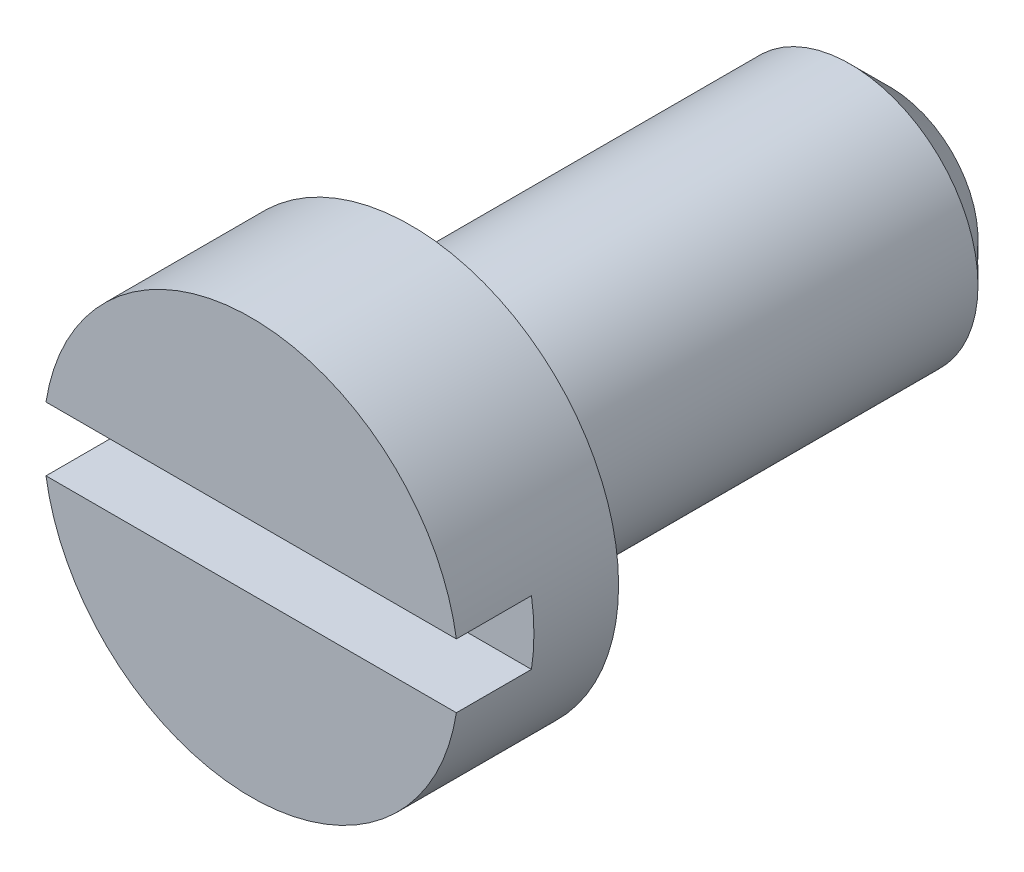
ISO-10303-21;
HEADER;
FILE_DESCRIPTION(('STEP AP214'),'2;1');
FILE_NAME('part.step','',(''),(''),'','','');
FILE_SCHEMA(('AUTOMOTIVE_DESIGN { 1 0 10303 214 1 1 1 1 }'));
ENDSEC;
DATA;
#1=APPLICATION_CONTEXT('core data for automotive mechanical design processes');
#2=APPLICATION_PROTOCOL_DEFINITION('international standard','automotive_design',2000,#1);
#3=PRODUCT_CONTEXT('',#1,'mechanical');
#4=PRODUCT('Part','Part','',(#3));
#5=PRODUCT_RELATED_PRODUCT_CATEGORY('part','',(#4));
#6=PRODUCT_DEFINITION_FORMATION('','',#4);
#7=PRODUCT_DEFINITION_CONTEXT('part definition',#1,'design');
#8=PRODUCT_DEFINITION('design','',#6,#7);
#9=PRODUCT_DEFINITION_SHAPE('','',#8);
#10=(LENGTH_UNIT() NAMED_UNIT(*) SI_UNIT(.MILLI.,.METRE.));
#11=(NAMED_UNIT(*) PLANE_ANGLE_UNIT() SI_UNIT($,.RADIAN.));
#12=(NAMED_UNIT(*) SI_UNIT($,.STERADIAN.) SOLID_ANGLE_UNIT());
#13=UNCERTAINTY_MEASURE_WITH_UNIT(LENGTH_MEASURE(1.E-05),#10,'distance_accuracy_value','');
#14=(GEOMETRIC_REPRESENTATION_CONTEXT(3) GLOBAL_UNCERTAINTY_ASSIGNED_CONTEXT((#13)) GLOBAL_UNIT_ASSIGNED_CONTEXT((#10,
#11,#12)) REPRESENTATION_CONTEXT('',''));
#15=CARTESIAN_POINT('',(0.,0.,0.));
#16=DIRECTION('',(0.,0.,1.));
#17=DIRECTION('',(1.,0.,0.));
#18=AXIS2_PLACEMENT_3D('',#15,#16,#17);
#19=CARTESIAN_POINT('',(0.,0.,5.));
#20=DIRECTION('',(0.,0.,1.));
#21=DIRECTION('',(1.,0.,0.));
#22=AXIS2_PLACEMENT_3D('',#19,#20,#21);
#23=PLANE('',#22);
#24=DIRECTION('',(-1.,0.,0.));
#25=VECTOR('',#24,1.);
#26=CARTESIAN_POINT('',(0.,1.,5.));
#27=LINE('',#26,#25);
#28=CARTESIAN_POINT('',(6.42261628933257,1.,5.));
#29=VERTEX_POINT('',#28);
#30=CARTESIAN_POINT('',(-6.42261628933257,1.,5.));
#31=VERTEX_POINT('',#30);
#32=EDGE_CURVE('E77',#29,#31,#27,.T.);
#33=ORIENTED_EDGE('',*,*,#32,.F.);
#34=CARTESIAN_POINT('',(0.,0.,5.));
#35=DIRECTION('',(0.,0.,1.));
#36=DIRECTION('',(1.,0.,0.));
#37=AXIS2_PLACEMENT_3D('',#34,#35,#36);
#38=CIRCLE('',#37,6.5);
#39=EDGE_CURVE('E90',#29,#31,#38,.T.);
#40=ORIENTED_EDGE('',*,*,#39,.T.);
#41=EDGE_LOOP('',(#33,#40));
#42=FACE_BOUND('',#41,.T.);
#43=ADVANCED_FACE('F29',(#42),#23,.T.);
#44=CARTESIAN_POINT('',(0.,0.,0.));
#45=DIRECTION('',(0.,0.,1.));
#46=DIRECTION('',(1.,0.,0.));
#47=AXIS2_PLACEMENT_3D('',#44,#45,#46);
#48=PLANE('',#47);
#49=CARTESIAN_POINT('',(0.,0.,0.));
#50=DIRECTION('',(0.,0.,1.));
#51=DIRECTION('',(1.,0.,0.));
#52=AXIS2_PLACEMENT_3D('',#49,#50,#51);
#53=CIRCLE('',#52,6.5);
#54=CARTESIAN_POINT('',(6.5,0.,0.));
#55=VERTEX_POINT('',#54);
#56=EDGE_CURVE('E91',#55,#55,#53,.T.);
#57=ORIENTED_EDGE('',*,*,#56,.F.);
#58=EDGE_LOOP('',(#57));
#59=FACE_BOUND('',#58,.T.);
#60=CARTESIAN_POINT('',(0.,0.,0.));
#61=DIRECTION('',(0.,0.,1.));
#62=DIRECTION('',(1.,0.,0.));
#63=AXIS2_PLACEMENT_3D('',#60,#61,#62);
#64=CIRCLE('',#63,4.);
#65=CARTESIAN_POINT('',(4.,0.,0.));
#66=VERTEX_POINT('',#65);
#67=EDGE_CURVE('E78',#66,#66,#64,.F.);
#68=ORIENTED_EDGE('',*,*,#67,.F.);
#69=EDGE_LOOP('',(#68));
#70=FACE_BOUND('',#69,.T.);
#71=ADVANCED_FACE('F118',(#59,#70),#48,.F.);
#72=CARTESIAN_POINT('',(0.,0.,5.));
#73=DIRECTION('',(0.,0.,-1.));
#74=DIRECTION('',(-1.,0.,0.));
#75=AXIS2_PLACEMENT_3D('',#72,#73,#74);
#76=CYLINDRICAL_SURFACE('',#75,6.5);
#77=CARTESIAN_POINT('',(0.,0.,2.65));
#78=DIRECTION('',(0.,0.,1.));
#79=DIRECTION('',(1.,0.,0.));
#80=AXIS2_PLACEMENT_3D('',#77,#78,#79);
#81=CIRCLE('',#80,6.5);
#82=CARTESIAN_POINT('',(-6.42261628933257,1.,2.65));
#83=VERTEX_POINT('',#82);
#84=CARTESIAN_POINT('',(-6.42261628933257,-1.,2.65));
#85=VERTEX_POINT('',#84);
#86=EDGE_CURVE('E102',#83,#85,#81,.T.);
#87=ORIENTED_EDGE('',*,*,#86,.F.);
#88=DIRECTION('',(0.,0.,-1.));
#89=VECTOR('',#88,1.);
#90=CARTESIAN_POINT('',(-6.42261628933257,1.,5.));
#91=LINE('',#90,#89);
#92=EDGE_CURVE('E52',#83,#31,#91,.F.);
#93=ORIENTED_EDGE('',*,*,#92,.T.);
#94=ORIENTED_EDGE('',*,*,#39,.F.);
#95=DIRECTION('',(0.,0.,-1.));
#96=VECTOR('',#95,1.);
#97=CARTESIAN_POINT('',(6.42261628933257,1.,5.));
#98=LINE('',#97,#96);
#99=CARTESIAN_POINT('',(6.42261628933257,1.,2.65));
#100=VERTEX_POINT('',#99);
#101=EDGE_CURVE('E95',#29,#100,#98,.T.);
#102=ORIENTED_EDGE('',*,*,#101,.T.);
#103=CARTESIAN_POINT('',(6.42261628933257,-1.,2.65));
#104=VERTEX_POINT('',#103);
#105=EDGE_CURVE('E86',#104,#100,#81,.T.);
#106=ORIENTED_EDGE('',*,*,#105,.F.);
#107=DIRECTION('',(0.,0.,-1.));
#108=VECTOR('',#107,1.);
#109=CARTESIAN_POINT('',(6.42261628933257,-1.,5.));
#110=LINE('',#109,#108);
#111=CARTESIAN_POINT('',(6.42261628933257,-1.,5.));
#112=VERTEX_POINT('',#111);
#113=EDGE_CURVE('E72',#104,#112,#110,.F.);
#114=ORIENTED_EDGE('',*,*,#113,.T.);
#115=CARTESIAN_POINT('',(-6.42261628933257,-1.,5.));
#116=VERTEX_POINT('',#115);
#117=EDGE_CURVE('E84',#116,#112,#38,.T.);
#118=ORIENTED_EDGE('',*,*,#117,.F.);
#119=DIRECTION('',(0.,0.,-1.));
#120=VECTOR('',#119,1.);
#121=CARTESIAN_POINT('',(-6.42261628933257,-1.,5.));
#122=LINE('',#121,#120);
#123=EDGE_CURVE('E44',#116,#85,#122,.T.);
#124=ORIENTED_EDGE('',*,*,#123,.T.);
#125=EDGE_LOOP('',(#87,#93,#94,#102,#106,#114,#118,#124));
#126=FACE_BOUND('',#125,.T.);
#127=ORIENTED_EDGE('',*,*,#56,.T.);
#128=EDGE_LOOP('',(#127));
#129=FACE_BOUND('',#128,.T.);
#130=ADVANCED_FACE('F31',(#126,#129),#76,.T.);
#131=DIRECTION('',(1.,0.,0.));
#132=VECTOR('',#131,1.);
#133=CARTESIAN_POINT('',(0.,-1.,5.));
#134=LINE('',#133,#132);
#135=EDGE_CURVE('E69',#116,#112,#134,.T.);
#136=ORIENTED_EDGE('',*,*,#135,.F.);
#137=ORIENTED_EDGE('',*,*,#117,.T.);
#138=EDGE_LOOP('',(#136,#137));
#139=FACE_BOUND('',#138,.T.);
#140=ADVANCED_FACE('F89',(#139),#23,.T.);
#141=CARTESIAN_POINT('',(0.,0.,-15.));
#142=DIRECTION('',(0.,0.,1.));
#143=DIRECTION('',(1.,0.,0.));
#144=AXIS2_PLACEMENT_3D('',#141,#142,#143);
#145=CYLINDRICAL_SURFACE('',#144,4.);
#146=CARTESIAN_POINT('',(0.,0.,-13.75));
#147=DIRECTION('',(0.,0.,-1.));
#148=DIRECTION('',(-1.,0.,0.));
#149=AXIS2_PLACEMENT_3D('',#146,#147,#148);
#150=CIRCLE('',#149,4.);
#151=CARTESIAN_POINT('',(-4.,0.,-13.75));
#152=VERTEX_POINT('',#151);
#153=EDGE_CURVE('E11',#152,#152,#150,.F.);
#154=ORIENTED_EDGE('',*,*,#153,.T.);
#155=EDGE_LOOP('',(#154));
#156=FACE_BOUND('',#155,.T.);
#157=ORIENTED_EDGE('',*,*,#67,.T.);
#158=EDGE_LOOP('',(#157));
#159=FACE_BOUND('',#158,.T.);
#160=ADVANCED_FACE('F126',(#156,#159),#145,.T.);
#161=CARTESIAN_POINT('',(0.,0.,-15.));
#162=DIRECTION('',(0.,0.,-1.));
#163=DIRECTION('',(-1.,0.,0.));
#164=AXIS2_PLACEMENT_3D('',#161,#162,#163);
#165=PLANE('',#164);
#166=CARTESIAN_POINT('',(0.,0.,-15.));
#167=DIRECTION('',(0.,0.,-1.));
#168=DIRECTION('',(-1.,0.,0.));
#169=AXIS2_PLACEMENT_3D('',#166,#167,#168);
#170=CIRCLE('',#169,2.75000000000001);
#171=CARTESIAN_POINT('',(-2.75000000000001,0.,-15.));
#172=VERTEX_POINT('',#171);
#173=EDGE_CURVE('E37',#172,#172,#170,.T.);
#174=ORIENTED_EDGE('',*,*,#173,.T.);
#175=EDGE_LOOP('',(#174));
#176=FACE_BOUND('',#175,.T.);
#177=ADVANCED_FACE('F131',(#176),#165,.T.);
#178=CARTESIAN_POINT('',(-6.83177715530657,1.,2.65));
#179=DIRECTION('',(0.,0.,1.));
#180=DIRECTION('',(1.,0.,0.));
#181=AXIS2_PLACEMENT_3D('',#178,#179,#180);
#182=PLANE('',#181);
#183=ORIENTED_EDGE('',*,*,#86,.T.);
#184=DIRECTION('',(1.,0.,0.));
#185=VECTOR('',#184,1.);
#186=CARTESIAN_POINT('',(-6.83177715530657,-1.,2.65));
#187=LINE('',#186,#185);
#188=EDGE_CURVE('E108',#85,#104,#187,.T.);
#189=ORIENTED_EDGE('',*,*,#188,.T.);
#190=ORIENTED_EDGE('',*,*,#105,.T.);
#191=DIRECTION('',(-1.,0.,0.));
#192=VECTOR('',#191,1.);
#193=CARTESIAN_POINT('',(-6.83177715530657,1.,2.65));
#194=LINE('',#193,#192);
#195=EDGE_CURVE('E87',#100,#83,#194,.T.);
#196=ORIENTED_EDGE('',*,*,#195,.T.);
#197=EDGE_LOOP('',(#183,#189,#190,#196));
#198=FACE_BOUND('',#197,.T.);
#199=ADVANCED_FACE('F107',(#198),#182,.T.);
#200=CARTESIAN_POINT('',(-6.83177715530657,1.,2.65));
#201=DIRECTION('',(0.,1.,0.));
#202=DIRECTION('',(0.,0.,1.));
#203=AXIS2_PLACEMENT_3D('',#200,#201,#202);
#204=PLANE('',#203);
#205=ORIENTED_EDGE('',*,*,#32,.T.);
#206=ORIENTED_EDGE('',*,*,#92,.F.);
#207=ORIENTED_EDGE('',*,*,#195,.F.);
#208=ORIENTED_EDGE('',*,*,#101,.F.);
#209=EDGE_LOOP('',(#205,#206,#207,#208));
#210=FACE_BOUND('',#209,.T.);
#211=ADVANCED_FACE('F115',(#210),#204,.F.);
#212=CARTESIAN_POINT('',(-6.83177715530657,-1.,2.65));
#213=DIRECTION('',(0.,-1.,0.));
#214=DIRECTION('',(1.,0.,0.));
#215=AXIS2_PLACEMENT_3D('',#212,#213,#214);
#216=PLANE('',#215);
#217=ORIENTED_EDGE('',*,*,#135,.T.);
#218=ORIENTED_EDGE('',*,*,#113,.F.);
#219=ORIENTED_EDGE('',*,*,#188,.F.);
#220=ORIENTED_EDGE('',*,*,#123,.F.);
#221=EDGE_LOOP('',(#217,#218,#219,#220));
#222=FACE_BOUND('',#221,.T.);
#223=ADVANCED_FACE('F71',(#222),#216,.F.);
#224=CARTESIAN_POINT('',(0.,0.,-15.));
#225=DIRECTION('',(0.,0.,1.));
#226=DIRECTION('',(1.,0.,0.));
#227=AXIS2_PLACEMENT_3D('',#224,#225,#226);
#228=CONICAL_SURFACE('',#227,2.75000000000001,0.785398163397445);
#229=ORIENTED_EDGE('',*,*,#153,.F.);
#230=EDGE_LOOP('',(#229));
#231=FACE_BOUND('',#230,.T.);
#232=ORIENTED_EDGE('',*,*,#173,.F.);
#233=EDGE_LOOP('',(#232));
#234=FACE_BOUND('',#233,.T.);
#235=ADVANCED_FACE('F173',(#231,#234),#228,.T.);
#236=CLOSED_SHELL('',(#43,#71,#130,#140,#160,#177,#199,#211,#223,#235));
#237=MANIFOLD_SOLID_BREP('B2',#236);
#238=ADVANCED_BREP_SHAPE_REPRESENTATION('',(#18,#237),#14);
#239=SHAPE_DEFINITION_REPRESENTATION(#9,#238);
ENDSEC;
END-ISO-10303-21;
